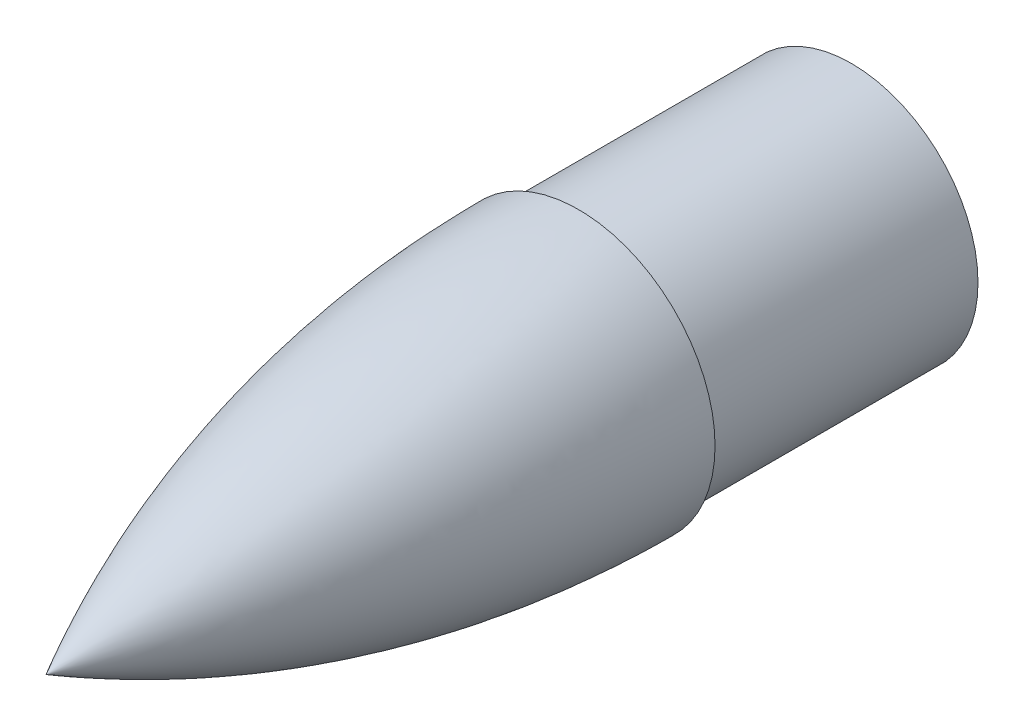
ISO-10303-21;
HEADER;
FILE_DESCRIPTION(('STEP AP214'),'2;1');
FILE_NAME('part.step','',(''),(''),'','','');
FILE_SCHEMA(('AUTOMOTIVE_DESIGN { 1 0 10303 214 1 1 1 1 }'));
ENDSEC;
DATA;
#1=APPLICATION_CONTEXT('core data for automotive mechanical design processes');
#2=APPLICATION_PROTOCOL_DEFINITION('international standard','automotive_design',2000,#1);
#3=PRODUCT_CONTEXT('',#1,'mechanical');
#4=PRODUCT('Part','Part','',(#3));
#5=PRODUCT_RELATED_PRODUCT_CATEGORY('part','',(#4));
#6=PRODUCT_DEFINITION_FORMATION('','',#4);
#7=PRODUCT_DEFINITION_CONTEXT('part definition',#1,'design');
#8=PRODUCT_DEFINITION('design','',#6,#7);
#9=PRODUCT_DEFINITION_SHAPE('','',#8);
#10=(LENGTH_UNIT() NAMED_UNIT(*) SI_UNIT(.MILLI.,.METRE.));
#11=(NAMED_UNIT(*) PLANE_ANGLE_UNIT() SI_UNIT($,.RADIAN.));
#12=(NAMED_UNIT(*) SI_UNIT($,.STERADIAN.) SOLID_ANGLE_UNIT());
#13=UNCERTAINTY_MEASURE_WITH_UNIT(LENGTH_MEASURE(1.E-05),#10,'distance_accuracy_value','');
#14=(GEOMETRIC_REPRESENTATION_CONTEXT(3) GLOBAL_UNCERTAINTY_ASSIGNED_CONTEXT((#13)) GLOBAL_UNIT_ASSIGNED_CONTEXT((#10,
#11,#12)) REPRESENTATION_CONTEXT('',''));
#15=CARTESIAN_POINT('',(0.,0.,0.));
#16=DIRECTION('',(0.,0.,1.));
#17=DIRECTION('',(1.,0.,0.));
#18=AXIS2_PLACEMENT_3D('',#15,#16,#17);
#19=CARTESIAN_POINT('',(0.,329.69512195122,-82.));
#20=DIRECTION('',(0.,0.,-1.));
#21=DIRECTION('',(-1.,0.,0.));
#22=AXIS2_PLACEMENT_3D('',#19,#20,#21);
#23=PLANE('',#22);
#24=CARTESIAN_POINT('',(0.,291.69512195122,-82.));
#25=DIRECTION('',(0.,0.,-1.));
#26=DIRECTION('',(-1.,0.,0.));
#27=AXIS2_PLACEMENT_3D('',#24,#25,#26);
#28=CIRCLE('',#27,38.);
#29=CARTESIAN_POINT('',(-38.,291.69512195122,-82.));
#30=VERTEX_POINT('',#29);
#31=EDGE_CURVE('E11',#30,#30,#28,.T.);
#32=ORIENTED_EDGE('',*,*,#31,.T.);
#33=EDGE_LOOP('',(#32));
#34=FACE_BOUND('',#33,.T.);
#35=ADVANCED_FACE('F46',(#34),#23,.T.);
#36=CARTESIAN_POINT('',(0.,291.69512195122,160.));
#37=DIRECTION('',(0.,0.,-1.));
#38=DIRECTION('',(-1.,0.,0.));
#39=AXIS2_PLACEMENT_3D('',#36,#37,#38);
#40=CYLINDRICAL_SURFACE('',#39,38.);
#41=CARTESIAN_POINT('',(0.,291.69512195122,0.));
#42=DIRECTION('',(0.,0.,-1.));
#43=DIRECTION('',(-1.,0.,0.));
#44=AXIS2_PLACEMENT_3D('',#41,#42,#43);
#45=CIRCLE('',#44,38.);
#46=CARTESIAN_POINT('',(-38.,291.69512195122,0.));
#47=VERTEX_POINT('',#46);
#48=EDGE_CURVE('E55',#47,#47,#45,.T.);
#49=ORIENTED_EDGE('',*,*,#48,.T.);
#50=EDGE_LOOP('',(#49));
#51=FACE_BOUND('',#50,.T.);
#52=ORIENTED_EDGE('',*,*,#31,.F.);
#53=EDGE_LOOP('',(#52));
#54=FACE_BOUND('',#53,.T.);
#55=ADVANCED_FACE('F111',(#51,#54),#40,.T.);
#56=CARTESIAN_POINT('',(0.,332.69512195122,0.));
#57=DIRECTION('',(0.,0.,-1.));
#58=DIRECTION('',(-1.,0.,0.));
#59=AXIS2_PLACEMENT_3D('',#56,#57,#58);
#60=PLANE('',#59);
#61=CARTESIAN_POINT('',(0.,291.69512195122,0.));
#62=DIRECTION('',(0.,0.,-1.));
#63=DIRECTION('',(-1.,0.,0.));
#64=AXIS2_PLACEMENT_3D('',#61,#62,#63);
#65=CIRCLE('',#64,41.);
#66=CARTESIAN_POINT('',(-41.,291.69512195122,0.));
#67=VERTEX_POINT('',#66);
#68=EDGE_CURVE('E68',#67,#67,#65,.T.);
#69=ORIENTED_EDGE('',*,*,#68,.T.);
#70=EDGE_LOOP('',(#69));
#71=FACE_BOUND('',#70,.T.);
#72=ORIENTED_EDGE('',*,*,#48,.F.);
#73=EDGE_LOOP('',(#72));
#74=FACE_BOUND('',#73,.T.);
#75=ADVANCED_FACE('F64',(#71,#74),#60,.T.);
#76=CARTESIAN_POINT('',(291.69512195122,291.69512195122,0.));
#77=DIRECTION('',(0.,-1.,0.));
#78=DIRECTION('',(-1.,0.,0.));
#79=AXIS2_PLACEMENT_3D('',#76,#77,#78);
#80=CIRCLE('',#79,332.69512195122);
#81=TRIMMED_CURVE('',#80,(PARAMETER_VALUE(-0.501704621408637)),
(PARAMETER_VALUE(0.501704621408637)),.T.,.PARAMETER.);
#82=CARTESIAN_POINT('',(0.,291.69512195122,0.));
#83=DIRECTION('',(0.,0.,-1.));
#84=AXIS1_PLACEMENT('',#82,#83);
#85=SURFACE_OF_REVOLUTION('',#81,#84);
#86=CARTESIAN_POINT('',(0.,291.69512195122,160.));
#87=VERTEX_POINT('',#86);
#88=VERTEX_LOOP('',#87);
#89=FACE_BOUND('',#88,.T.);
#90=ORIENTED_EDGE('',*,*,#68,.F.);
#91=EDGE_LOOP('',(#90));
#92=FACE_BOUND('',#91,.T.);
#93=ADVANCED_FACE('F61',(#89,#92),#85,.T.);
#94=CLOSED_SHELL('',(#35,#55,#75,#93));
#95=CARTESIAN_POINT('',(291.69512195122,291.69512195122,0.));
#96=DIRECTION('',(0.,-1.,0.));
#97=DIRECTION('',(-1.,0.,0.));
#98=AXIS2_PLACEMENT_3D('',#95,#96,#97);
#99=CIRCLE('',#98,328.173102524626);
#100=TRIMMED_CURVE('',#99,(PARAMETER_VALUE(-0.475977373069351)),
(PARAMETER_VALUE(0.475977373069351)),.T.,.PARAMETER.);
#101=CARTESIAN_POINT('',(0.,291.69512195122,0.));
#102=DIRECTION('',(0.,0.,-1.));
#103=AXIS1_PLACEMENT('',#101,#102);
#104=SURFACE_OF_REVOLUTION('',#100,#103);
#105=CARTESIAN_POINT('',(0.,291.69512195122,4.52201942659322));
#106=DIRECTION('',(0.,0.,-1.));
#107=DIRECTION('',(-1.,0.,0.));
#108=AXIS2_PLACEMENT_3D('',#105,#106,#107);
#109=CIRCLE('',#108,36.4468237993115);
#110=CARTESIAN_POINT('',(-36.4468237993115,291.69512195122,4.52201942659322));
#111=VERTEX_POINT('',#110);
#112=EDGE_CURVE('E71',#111,#111,#109,.T.);
#113=ORIENTED_EDGE('',*,*,#112,.T.);
#114=EDGE_LOOP('',(#113));
#115=FACE_BOUND('',#114,.T.);
#116=CARTESIAN_POINT('',(0.,291.69512195122,150.371343847497));
#117=VERTEX_POINT('',#116);
#118=VERTEX_LOOP('',#117);
#119=FACE_BOUND('',#118,.T.);
#120=ADVANCED_FACE('F100',(#115,#119),#104,.F.);
#121=CARTESIAN_POINT('',(0.,328.141945750531,4.52201942659324));
#122=DIRECTION('',(0.,0.,1.));
#123=DIRECTION('',(1.,0.,0.));
#124=AXIS2_PLACEMENT_3D('',#121,#122,#123);
#125=PLANE('',#124);
#126=CARTESIAN_POINT('',(0.,291.69512195122,4.52201942659325));
#127=DIRECTION('',(0.,0.,-1.));
#128=DIRECTION('',(-1.,0.,0.));
#129=AXIS2_PLACEMENT_3D('',#126,#127,#128);
#130=CIRCLE('',#129,33.4779805734067);
#131=CARTESIAN_POINT('',(-33.4779805734067,291.69512195122,4.52201942659325));
#132=VERTEX_POINT('',#131);
#133=EDGE_CURVE('E77',#132,#132,#130,.T.);
#134=ORIENTED_EDGE('',*,*,#133,.T.);
#135=EDGE_LOOP('',(#134));
#136=FACE_BOUND('',#135,.T.);
#137=ORIENTED_EDGE('',*,*,#112,.F.);
#138=EDGE_LOOP('',(#137));
#139=FACE_BOUND('',#138,.T.);
#140=ADVANCED_FACE('F98',(#136,#139),#125,.T.);
#141=CARTESIAN_POINT('',(0.,291.69512195122,160.));
#142=DIRECTION('',(0.,0.,-1.));
#143=DIRECTION('',(-1.,0.,0.));
#144=AXIS2_PLACEMENT_3D('',#141,#142,#143);
#145=CYLINDRICAL_SURFACE('',#144,33.4779805734067);
#146=CARTESIAN_POINT('',(0.,291.69512195122,-77.4779805734067));
#147=DIRECTION('',(0.,0.,-1.));
#148=DIRECTION('',(-1.,0.,0.));
#149=AXIS2_PLACEMENT_3D('',#146,#147,#148);
#150=CIRCLE('',#149,33.4779805734067);
#151=CARTESIAN_POINT('',(-33.4779805734067,291.69512195122,-77.4779805734067));
#152=VERTEX_POINT('',#151);
#153=EDGE_CURVE('E83',#152,#152,#150,.T.);
#154=ORIENTED_EDGE('',*,*,#153,.T.);
#155=EDGE_LOOP('',(#154));
#156=FACE_BOUND('',#155,.T.);
#157=ORIENTED_EDGE('',*,*,#133,.F.);
#158=EDGE_LOOP('',(#157));
#159=FACE_BOUND('',#158,.T.);
#160=ADVANCED_FACE('F88',(#156,#159),#145,.F.);
#161=CARTESIAN_POINT('',(0.,325.173102524626,-77.4779805734067));
#162=DIRECTION('',(0.,0.,1.));
#163=DIRECTION('',(1.,0.,0.));
#164=AXIS2_PLACEMENT_3D('',#161,#162,#163);
#165=PLANE('',#164);
#166=ORIENTED_EDGE('',*,*,#153,.F.);
#167=EDGE_LOOP('',(#166));
#168=FACE_BOUND('',#167,.T.);
#169=ADVANCED_FACE('F91',(#168),#165,.T.);
#170=CLOSED_SHELL('',(#120,#140,#160,#169));
#171=ORIENTED_CLOSED_SHELL('',*,#170,.T.);
#172=BREP_WITH_VOIDS('B2',#94,(#171));
#173=ADVANCED_BREP_SHAPE_REPRESENTATION('',(#18,#172),#14);
#174=SHAPE_DEFINITION_REPRESENTATION(#9,#173);
ENDSEC;
END-ISO-10303-21;
